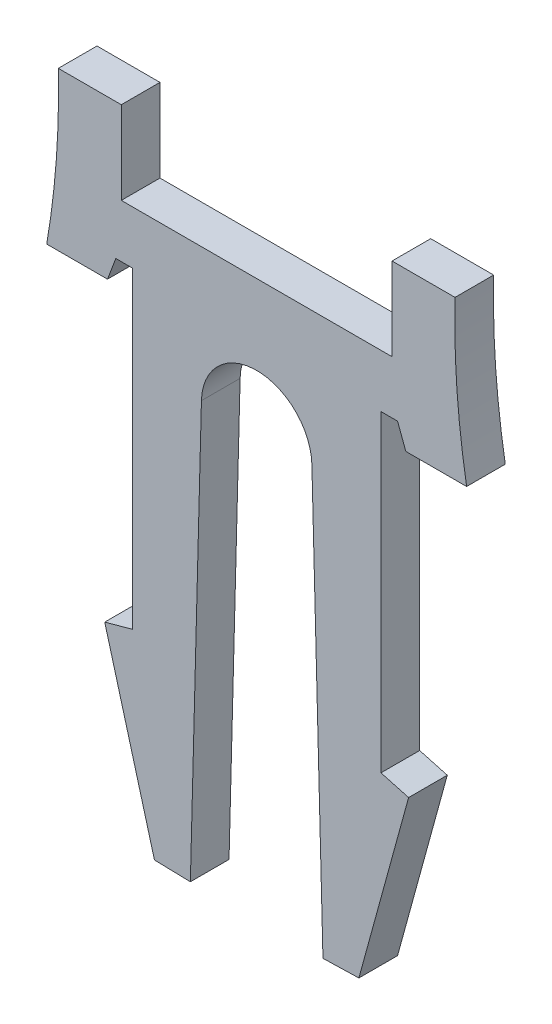
ISO-10303-21;
HEADER;
FILE_DESCRIPTION(('STEP AP214'),'2;1');
FILE_NAME('part.step','',(''),(''),'','','');
FILE_SCHEMA(('AUTOMOTIVE_DESIGN { 1 0 10303 214 1 1 1 1 }'));
ENDSEC;
DATA;
#1=APPLICATION_CONTEXT('core data for automotive mechanical design processes');
#2=APPLICATION_PROTOCOL_DEFINITION('international standard','automotive_design',2000,#1);
#3=PRODUCT_CONTEXT('',#1,'mechanical');
#4=PRODUCT('Part','Part','',(#3));
#5=PRODUCT_RELATED_PRODUCT_CATEGORY('part','',(#4));
#6=PRODUCT_DEFINITION_FORMATION('','',#4);
#7=PRODUCT_DEFINITION_CONTEXT('part definition',#1,'design');
#8=PRODUCT_DEFINITION('design','',#6,#7);
#9=PRODUCT_DEFINITION_SHAPE('','',#8);
#10=(LENGTH_UNIT() NAMED_UNIT(*) SI_UNIT(.MILLI.,.METRE.));
#11=(NAMED_UNIT(*) PLANE_ANGLE_UNIT() SI_UNIT($,.RADIAN.));
#12=(NAMED_UNIT(*) SI_UNIT($,.STERADIAN.) SOLID_ANGLE_UNIT());
#13=UNCERTAINTY_MEASURE_WITH_UNIT(LENGTH_MEASURE(1.E-05),#10,'distance_accuracy_value','');
#14=(GEOMETRIC_REPRESENTATION_CONTEXT(3) GLOBAL_UNCERTAINTY_ASSIGNED_CONTEXT((#13)) GLOBAL_UNIT_ASSIGNED_CONTEXT((#10,
#11,#12)) REPRESENTATION_CONTEXT('',''));
#15=CARTESIAN_POINT('',(0.,0.,0.));
#16=DIRECTION('',(0.,0.,1.));
#17=DIRECTION('',(1.,0.,0.));
#18=AXIS2_PLACEMENT_3D('',#15,#16,#17);
#19=CARTESIAN_POINT('',(-1.225,1.22,-0.35));
#20=DIRECTION('',(1.,0.,0.));
#21=DIRECTION('',(0.,0.,-1.));
#22=AXIS2_PLACEMENT_3D('',#19,#20,#21);
#23=PLANE('',#22);
#24=DIRECTION('',(0.,1.,0.));
#25=VECTOR('',#24,1.);
#26=CARTESIAN_POINT('',(-1.225,1.22,0.));
#27=LINE('',#26,#25);
#28=CARTESIAN_POINT('',(-1.225,1.22,0.));
#29=VERTEX_POINT('',#28);
#30=CARTESIAN_POINT('',(-1.225,1.97,0.));
#31=VERTEX_POINT('',#30);
#32=EDGE_CURVE('E229',#29,#31,#27,.T.);
#33=ORIENTED_EDGE('',*,*,#32,.F.);
#34=DIRECTION('',(0.,0.,1.));
#35=VECTOR('',#34,1.);
#36=CARTESIAN_POINT('',(-1.225,1.22,-0.35));
#37=LINE('',#36,#35);
#38=CARTESIAN_POINT('',(-1.225,1.22,-0.35));
#39=VERTEX_POINT('',#38);
#40=EDGE_CURVE('E11',#39,#29,#37,.T.);
#41=ORIENTED_EDGE('',*,*,#40,.F.);
#42=DIRECTION('',(0.,1.,0.));
#43=VECTOR('',#42,1.);
#44=CARTESIAN_POINT('',(-1.225,1.22,-0.35));
#45=LINE('',#44,#43);
#46=CARTESIAN_POINT('',(-1.225,1.97,-0.35));
#47=VERTEX_POINT('',#46);
#48=EDGE_CURVE('E297',#39,#47,#45,.T.);
#49=ORIENTED_EDGE('',*,*,#48,.T.);
#50=DIRECTION('',(0.,0.,1.));
#51=VECTOR('',#50,1.);
#52=CARTESIAN_POINT('',(-1.225,1.97,-0.35));
#53=LINE('',#52,#51);
#54=EDGE_CURVE('E39',#47,#31,#53,.T.);
#55=ORIENTED_EDGE('',*,*,#54,.T.);
#56=EDGE_LOOP('',(#33,#41,#49,#55));
#57=FACE_BOUND('',#56,.T.);
#58=ADVANCED_FACE('F36',(#57),#23,.T.);
#59=CARTESIAN_POINT('',(-1.225,1.22,-0.35));
#60=DIRECTION('',(0.,1.,0.));
#61=DIRECTION('',(0.,0.,1.));
#62=AXIS2_PLACEMENT_3D('',#59,#60,#61);
#63=PLANE('',#62);
#64=DIRECTION('',(-1.,0.,0.));
#65=VECTOR('',#64,1.);
#66=CARTESIAN_POINT('',(-1.225,1.22,0.));
#67=LINE('',#66,#65);
#68=CARTESIAN_POINT('',(1.225,1.22,0.));
#69=VERTEX_POINT('',#68);
#70=EDGE_CURVE('E295',#69,#29,#67,.T.);
#71=ORIENTED_EDGE('',*,*,#70,.F.);
#72=DIRECTION('',(0.,0.,1.));
#73=VECTOR('',#72,1.);
#74=CARTESIAN_POINT('',(1.225,1.22,-0.35));
#75=LINE('',#74,#73);
#76=CARTESIAN_POINT('',(1.225,1.22,-0.35));
#77=VERTEX_POINT('',#76);
#78=EDGE_CURVE('E45',#77,#69,#75,.T.);
#79=ORIENTED_EDGE('',*,*,#78,.F.);
#80=DIRECTION('',(-1.,0.,0.));
#81=VECTOR('',#80,1.);
#82=CARTESIAN_POINT('',(-1.225,1.22,-0.35));
#83=LINE('',#82,#81);
#84=EDGE_CURVE('E219',#77,#39,#83,.T.);
#85=ORIENTED_EDGE('',*,*,#84,.T.);
#86=ORIENTED_EDGE('',*,*,#40,.T.);
#87=EDGE_LOOP('',(#71,#79,#85,#86));
#88=FACE_BOUND('',#87,.T.);
#89=ADVANCED_FACE('F341',(#88),#63,.T.);
#90=CARTESIAN_POINT('',(1.225,1.22,-0.35));
#91=DIRECTION('',(-1.,0.,0.));
#92=DIRECTION('',(0.,0.,1.));
#93=AXIS2_PLACEMENT_3D('',#90,#91,#92);
#94=PLANE('',#93);
#95=DIRECTION('',(0.,-1.,0.));
#96=VECTOR('',#95,1.);
#97=CARTESIAN_POINT('',(1.225,1.22,0.));
#98=LINE('',#97,#96);
#99=CARTESIAN_POINT('',(1.225,1.97,0.));
#100=VERTEX_POINT('',#99);
#101=EDGE_CURVE('E206',#100,#69,#98,.T.);
#102=ORIENTED_EDGE('',*,*,#101,.F.);
#103=DIRECTION('',(0.,0.,1.));
#104=VECTOR('',#103,1.);
#105=CARTESIAN_POINT('',(1.225,1.97,-0.35));
#106=LINE('',#105,#104);
#107=CARTESIAN_POINT('',(1.225,1.97,-0.35));
#108=VERTEX_POINT('',#107);
#109=EDGE_CURVE('E201',#108,#100,#106,.T.);
#110=ORIENTED_EDGE('',*,*,#109,.F.);
#111=DIRECTION('',(0.,-1.,0.));
#112=VECTOR('',#111,1.);
#113=CARTESIAN_POINT('',(1.225,1.22,-0.35));
#114=LINE('',#113,#112);
#115=EDGE_CURVE('E204',#108,#77,#114,.T.);
#116=ORIENTED_EDGE('',*,*,#115,.T.);
#117=ORIENTED_EDGE('',*,*,#78,.T.);
#118=EDGE_LOOP('',(#102,#110,#116,#117));
#119=FACE_BOUND('',#118,.T.);
#120=ADVANCED_FACE('F203',(#119),#94,.T.);
#121=CARTESIAN_POINT('',(1.225,1.97,-0.35));
#122=DIRECTION('',(0.,1.,0.));
#123=DIRECTION('',(-1.,0.,0.));
#124=AXIS2_PLACEMENT_3D('',#121,#122,#123);
#125=PLANE('',#124);
#126=DIRECTION('',(-1.,0.,0.));
#127=VECTOR('',#126,1.);
#128=CARTESIAN_POINT('',(1.225,1.97,0.));
#129=LINE('',#128,#127);
#130=CARTESIAN_POINT('',(1.795,1.97,0.));
#131=VERTEX_POINT('',#130);
#132=EDGE_CURVE('E292',#131,#100,#129,.T.);
#133=ORIENTED_EDGE('',*,*,#132,.F.);
#134=DIRECTION('',(0.,0.,1.));
#135=VECTOR('',#134,1.);
#136=CARTESIAN_POINT('',(1.795,1.97,-0.35));
#137=LINE('',#136,#135);
#138=CARTESIAN_POINT('',(1.795,1.97,-0.35));
#139=VERTEX_POINT('',#138);
#140=EDGE_CURVE('E211',#139,#131,#137,.T.);
#141=ORIENTED_EDGE('',*,*,#140,.F.);
#142=DIRECTION('',(-1.,0.,0.));
#143=VECTOR('',#142,1.);
#144=CARTESIAN_POINT('',(1.225,1.97,-0.35));
#145=LINE('',#144,#143);
#146=EDGE_CURVE('E217',#139,#108,#145,.T.);
#147=ORIENTED_EDGE('',*,*,#146,.T.);
#148=ORIENTED_EDGE('',*,*,#109,.T.);
#149=EDGE_LOOP('',(#133,#141,#147,#148));
#150=FACE_BOUND('',#149,.T.);
#151=ADVANCED_FACE('F221',(#150),#125,.T.);
#152=CARTESIAN_POINT('',(9.14292372881354,1.79067796610169,-0.35));
#153=DIRECTION('',(0.,0.,1.));
#154=DIRECTION('',(1.,0.,0.));
#155=AXIS2_PLACEMENT_3D('',#152,#153,#154);
#156=CYLINDRICAL_SURFACE('',#155,7.35011153087506);
#157=CARTESIAN_POINT('',(9.14292372881354,1.79067796610169,0.));
#158=DIRECTION('',(0.,0.,-1.));
#159=DIRECTION('',(1.,0.,0.));
#160=AXIS2_PLACEMENT_3D('',#157,#158,#159);
#161=CIRCLE('',#160,7.35011153087506);
#162=CARTESIAN_POINT('',(1.9,0.540000000000002,0.));
#163=VERTEX_POINT('',#162);
#164=EDGE_CURVE('E289',#163,#131,#161,.T.);
#165=ORIENTED_EDGE('',*,*,#164,.F.);
#166=DIRECTION('',(0.,0.,1.));
#167=VECTOR('',#166,1.);
#168=CARTESIAN_POINT('',(1.9,0.540000000000002,-0.35));
#169=LINE('',#168,#167);
#170=CARTESIAN_POINT('',(1.9,0.540000000000002,-0.35));
#171=VERTEX_POINT('',#170);
#172=EDGE_CURVE('E301',#171,#163,#169,.T.);
#173=ORIENTED_EDGE('',*,*,#172,.F.);
#174=CARTESIAN_POINT('',(9.14292372881354,1.79067796610169,-0.35));
#175=DIRECTION('',(0.,0.,-1.));
#176=DIRECTION('',(1.,0.,0.));
#177=AXIS2_PLACEMENT_3D('',#174,#175,#176);
#178=CIRCLE('',#177,7.35011153087506);
#179=EDGE_CURVE('E222',#171,#139,#178,.T.);
#180=ORIENTED_EDGE('',*,*,#179,.T.);
#181=ORIENTED_EDGE('',*,*,#140,.T.);
#182=EDGE_LOOP('',(#165,#173,#180,#181));
#183=FACE_BOUND('',#182,.T.);
#184=ADVANCED_FACE('F354',(#183),#156,.F.);
#185=CARTESIAN_POINT('',(1.9,0.54,-0.35));
#186=DIRECTION('',(0.,-1.,0.));
#187=DIRECTION('',(0.,0.,-1.));
#188=AXIS2_PLACEMENT_3D('',#185,#186,#187);
#189=PLANE('',#188);
#190=DIRECTION('',(1.,0.,0.));
#191=VECTOR('',#190,1.);
#192=CARTESIAN_POINT('',(1.9,0.54,0.));
#193=LINE('',#192,#191);
#194=CARTESIAN_POINT('',(1.35,0.54,0.));
#195=VERTEX_POINT('',#194);
#196=EDGE_CURVE('E286',#195,#163,#193,.T.);
#197=ORIENTED_EDGE('',*,*,#196,.F.);
#198=DIRECTION('',(0.,0.,1.));
#199=VECTOR('',#198,1.);
#200=CARTESIAN_POINT('',(1.35,0.54,-0.35));
#201=LINE('',#200,#199);
#202=CARTESIAN_POINT('',(1.35,0.54,-0.35));
#203=VERTEX_POINT('',#202);
#204=EDGE_CURVE('E303',#203,#195,#201,.T.);
#205=ORIENTED_EDGE('',*,*,#204,.F.);
#206=DIRECTION('',(1.,0.,0.));
#207=VECTOR('',#206,1.);
#208=CARTESIAN_POINT('',(1.9,0.54,-0.35));
#209=LINE('',#208,#207);
#210=EDGE_CURVE('E224',#203,#171,#209,.T.);
#211=ORIENTED_EDGE('',*,*,#210,.T.);
#212=ORIENTED_EDGE('',*,*,#172,.T.);
#213=EDGE_LOOP('',(#197,#205,#211,#212));
#214=FACE_BOUND('',#213,.T.);
#215=ADVANCED_FACE('F357',(#214),#189,.T.);
#216=CARTESIAN_POINT('',(1.35,0.54,-0.35));
#217=DIRECTION('',(-0.936329177569044,-0.351123441588393,0.));
#218=DIRECTION('',(0.351123441588393,-0.936329177569044,0.));
#219=AXIS2_PLACEMENT_3D('',#216,#217,#218);
#220=PLANE('',#219);
#221=DIRECTION('',(0.351123441588393,-0.936329177569044,0.));
#222=VECTOR('',#221,1.);
#223=CARTESIAN_POINT('',(1.35,0.54,0.));
#224=LINE('',#223,#222);
#225=CARTESIAN_POINT('',(1.275,0.74,0.));
#226=VERTEX_POINT('',#225);
#227=EDGE_CURVE('E283',#226,#195,#224,.T.);
#228=ORIENTED_EDGE('',*,*,#227,.F.);
#229=DIRECTION('',(0.,0.,1.));
#230=VECTOR('',#229,1.);
#231=CARTESIAN_POINT('',(1.275,0.74,-0.35));
#232=LINE('',#231,#230);
#233=CARTESIAN_POINT('',(1.275,0.74,-0.35));
#234=VERTEX_POINT('',#233);
#235=EDGE_CURVE('E305',#234,#226,#232,.T.);
#236=ORIENTED_EDGE('',*,*,#235,.F.);
#237=DIRECTION('',(0.351123441588393,-0.936329177569044,0.));
#238=VECTOR('',#237,1.);
#239=CARTESIAN_POINT('',(1.35,0.54,-0.35));
#240=LINE('',#239,#238);
#241=EDGE_CURVE('E699',#234,#203,#240,.T.);
#242=ORIENTED_EDGE('',*,*,#241,.T.);
#243=ORIENTED_EDGE('',*,*,#204,.T.);
#244=EDGE_LOOP('',(#228,#236,#242,#243));
#245=FACE_BOUND('',#244,.T.);
#246=ADVANCED_FACE('F361',(#245),#220,.T.);
#247=CARTESIAN_POINT('',(1.275,0.74,-0.35));
#248=DIRECTION('',(0.,-1.,0.));
#249=DIRECTION('',(0.,0.,-1.));
#250=AXIS2_PLACEMENT_3D('',#247,#248,#249);
#251=PLANE('',#250);
#252=DIRECTION('',(1.,0.,0.));
#253=VECTOR('',#252,1.);
#254=CARTESIAN_POINT('',(1.275,0.74,0.));
#255=LINE('',#254,#253);
#256=CARTESIAN_POINT('',(1.125,0.74,0.));
#257=VERTEX_POINT('',#256);
#258=EDGE_CURVE('E280',#257,#226,#255,.T.);
#259=ORIENTED_EDGE('',*,*,#258,.F.);
#260=DIRECTION('',(0.,0.,1.));
#261=VECTOR('',#260,1.);
#262=CARTESIAN_POINT('',(1.125,0.74,-0.35));
#263=LINE('',#262,#261);
#264=CARTESIAN_POINT('',(1.125,0.74,-0.35));
#265=VERTEX_POINT('',#264);
#266=EDGE_CURVE('E307',#265,#257,#263,.T.);
#267=ORIENTED_EDGE('',*,*,#266,.F.);
#268=DIRECTION('',(1.,0.,0.));
#269=VECTOR('',#268,1.);
#270=CARTESIAN_POINT('',(1.275,0.74,-0.35));
#271=LINE('',#270,#269);
#272=EDGE_CURVE('E703',#265,#234,#271,.T.);
#273=ORIENTED_EDGE('',*,*,#272,.T.);
#274=ORIENTED_EDGE('',*,*,#235,.T.);
#275=EDGE_LOOP('',(#259,#267,#273,#274));
#276=FACE_BOUND('',#275,.T.);
#277=ADVANCED_FACE('F365',(#276),#251,.T.);
#278=CARTESIAN_POINT('',(1.125,0.74,-0.35));
#279=DIRECTION('',(1.,0.,0.));
#280=DIRECTION('',(0.,0.,-1.));
#281=AXIS2_PLACEMENT_3D('',#278,#279,#280);
#282=PLANE('',#281);
#283=DIRECTION('',(0.,1.,0.));
#284=VECTOR('',#283,1.);
#285=CARTESIAN_POINT('',(1.125,0.74,0.));
#286=LINE('',#285,#284);
#287=CARTESIAN_POINT('',(1.125,-2.09137564335033,0.));
#288=VERTEX_POINT('',#287);
#289=EDGE_CURVE('E277',#288,#257,#286,.T.);
#290=ORIENTED_EDGE('',*,*,#289,.F.);
#291=DIRECTION('',(0.,0.,1.));
#292=VECTOR('',#291,1.);
#293=CARTESIAN_POINT('',(1.125,-2.09137564335033,-0.35));
#294=LINE('',#293,#292);
#295=CARTESIAN_POINT('',(1.125,-2.09137564335033,-0.35));
#296=VERTEX_POINT('',#295);
#297=EDGE_CURVE('E309',#296,#288,#294,.T.);
#298=ORIENTED_EDGE('',*,*,#297,.F.);
#299=DIRECTION('',(0.,1.,0.));
#300=VECTOR('',#299,1.);
#301=CARTESIAN_POINT('',(1.125,0.74,-0.35));
#302=LINE('',#301,#300);
#303=EDGE_CURVE('E692',#296,#265,#302,.T.);
#304=ORIENTED_EDGE('',*,*,#303,.T.);
#305=ORIENTED_EDGE('',*,*,#266,.T.);
#306=EDGE_LOOP('',(#290,#298,#304,#305));
#307=FACE_BOUND('',#306,.T.);
#308=ADVANCED_FACE('F369',(#307),#282,.T.);
#309=CARTESIAN_POINT('',(1.375,-2.16,-0.35));
#310=DIRECTION('',(0.26470588235294,0.964329194750294,0.));
#311=DIRECTION('',(-0.964329194750294,0.26470588235294,0.));
#312=AXIS2_PLACEMENT_3D('',#309,#310,#311);
#313=PLANE('',#312);
#314=DIRECTION('',(-0.964329194750294,0.26470588235294,0.));
#315=VECTOR('',#314,1.);
#316=CARTESIAN_POINT('',(1.375,-2.16,0.));
#317=LINE('',#316,#315);
#318=CARTESIAN_POINT('',(1.375,-2.16,0.));
#319=VERTEX_POINT('',#318);
#320=EDGE_CURVE('E274',#319,#288,#317,.T.);
#321=ORIENTED_EDGE('',*,*,#320,.F.);
#322=DIRECTION('',(0.,0.,1.));
#323=VECTOR('',#322,1.);
#324=CARTESIAN_POINT('',(1.375,-2.16,-0.35));
#325=LINE('',#324,#323);
#326=CARTESIAN_POINT('',(1.375,-2.16,-0.35));
#327=VERTEX_POINT('',#326);
#328=EDGE_CURVE('E311',#327,#319,#325,.T.);
#329=ORIENTED_EDGE('',*,*,#328,.F.);
#330=DIRECTION('',(-0.964329194750294,0.26470588235294,0.));
#331=VECTOR('',#330,1.);
#332=CARTESIAN_POINT('',(1.375,-2.16,-0.35));
#333=LINE('',#332,#331);
#334=EDGE_CURVE('E688',#327,#296,#333,.T.);
#335=ORIENTED_EDGE('',*,*,#334,.T.);
#336=ORIENTED_EDGE('',*,*,#297,.T.);
#337=EDGE_LOOP('',(#321,#329,#335,#336));
#338=FACE_BOUND('',#337,.T.);
#339=ADVANCED_FACE('F373',(#338),#313,.T.);
#340=CARTESIAN_POINT('',(0.925,-3.7993596310755,-0.35));
#341=DIRECTION('',(0.964329194750294,-0.264705882352941,0.));
#342=DIRECTION('',(0.264705882352941,0.964329194750294,0.));
#343=AXIS2_PLACEMENT_3D('',#340,#341,#342);
#344=PLANE('',#343);
#345=DIRECTION('',(0.264705882352941,0.964329194750294,0.));
#346=VECTOR('',#345,1.);
#347=CARTESIAN_POINT('',(0.925,-3.7993596310755,0.));
#348=LINE('',#347,#346);
#349=CARTESIAN_POINT('',(0.925,-3.7993596310755,0.));
#350=VERTEX_POINT('',#349);
#351=EDGE_CURVE('E271',#350,#319,#348,.T.);
#352=ORIENTED_EDGE('',*,*,#351,.F.);
#353=DIRECTION('',(0.,0.,1.));
#354=VECTOR('',#353,1.);
#355=CARTESIAN_POINT('',(0.925,-3.7993596310755,-0.35));
#356=LINE('',#355,#354);
#357=CARTESIAN_POINT('',(0.925,-3.7993596310755,-0.35));
#358=VERTEX_POINT('',#357);
#359=EDGE_CURVE('E313',#358,#350,#356,.T.);
#360=ORIENTED_EDGE('',*,*,#359,.F.);
#361=DIRECTION('',(0.264705882352941,0.964329194750294,0.));
#362=VECTOR('',#361,1.);
#363=CARTESIAN_POINT('',(0.925,-3.7993596310755,-0.35));
#364=LINE('',#363,#362);
#365=EDGE_CURVE('E709',#358,#327,#364,.T.);
#366=ORIENTED_EDGE('',*,*,#365,.T.);
#367=ORIENTED_EDGE('',*,*,#328,.T.);
#368=EDGE_LOOP('',(#352,#360,#366,#367));
#369=FACE_BOUND('',#368,.T.);
#370=ADVANCED_FACE('F377',(#369),#344,.T.);
#371=CARTESIAN_POINT('',(0.6,-3.80787990170184,-0.35));
#372=DIRECTION('',(0.0262072128803839,-0.999656532011391,0.));
#373=DIRECTION('',(0.999656532011391,0.0262072128803839,0.));
#374=AXIS2_PLACEMENT_3D('',#371,#372,#373);
#375=PLANE('',#374);
#376=DIRECTION('',(0.999656532011392,0.0262072128803839,0.));
#377=VECTOR('',#376,1.);
#378=CARTESIAN_POINT('',(0.6,-3.80787990170184,0.));
#379=LINE('',#378,#377);
#380=CARTESIAN_POINT('',(0.6,-3.80787990170184,0.));
#381=VERTEX_POINT('',#380);
#382=EDGE_CURVE('E268',#381,#350,#379,.T.);
#383=ORIENTED_EDGE('',*,*,#382,.F.);
#384=DIRECTION('',(0.,0.,1.));
#385=VECTOR('',#384,1.);
#386=CARTESIAN_POINT('',(0.6,-3.80787990170184,-0.35));
#387=LINE('',#386,#385);
#388=CARTESIAN_POINT('',(0.6,-3.80787990170184,-0.35));
#389=VERTEX_POINT('',#388);
#390=EDGE_CURVE('E315',#389,#381,#387,.T.);
#391=ORIENTED_EDGE('',*,*,#390,.F.);
#392=DIRECTION('',(0.999656532011392,0.0262072128803839,0.));
#393=VECTOR('',#392,1.);
#394=CARTESIAN_POINT('',(0.6,-3.80787990170184,-0.35));
#395=LINE('',#394,#393);
#396=EDGE_CURVE('E681',#389,#358,#395,.T.);
#397=ORIENTED_EDGE('',*,*,#396,.T.);
#398=ORIENTED_EDGE('',*,*,#359,.T.);
#399=EDGE_LOOP('',(#383,#391,#397,#398));
#400=FACE_BOUND('',#399,.T.);
#401=ADVANCED_FACE('F381',(#400),#375,.T.);
#402=CARTESIAN_POINT('',(0.499828266005696,0.0131036064401919,-0.35));
#403=DIRECTION('',(-0.999656532011392,-0.0262072128803837,0.));
#404=DIRECTION('',(0.0262072128803837,-0.999656532011392,0.));
#405=AXIS2_PLACEMENT_3D('',#402,#403,#404);
#406=PLANE('',#405);
#407=DIRECTION('',(0.0262072128803837,-0.999656532011392,0.));
#408=VECTOR('',#407,1.);
#409=CARTESIAN_POINT('',(0.499828266005696,0.0131036064401919,0.));
#410=LINE('',#409,#408);
#411=CARTESIAN_POINT('',(0.499828266005696,0.0131036064401919,0.));
#412=VERTEX_POINT('',#411);
#413=EDGE_CURVE('E265',#412,#381,#410,.T.);
#414=ORIENTED_EDGE('',*,*,#413,.F.);
#415=DIRECTION('',(0.,0.,1.));
#416=VECTOR('',#415,1.);
#417=CARTESIAN_POINT('',(0.499828266005696,0.0131036064401919,-0.35));
#418=LINE('',#417,#416);
#419=CARTESIAN_POINT('',(0.499828266005696,0.0131036064401919,-0.35));
#420=VERTEX_POINT('',#419);
#421=EDGE_CURVE('E317',#420,#412,#418,.T.);
#422=ORIENTED_EDGE('',*,*,#421,.F.);
#423=DIRECTION('',(0.0262072128803837,-0.999656532011392,0.));
#424=VECTOR('',#423,1.);
#425=CARTESIAN_POINT('',(0.499828266005696,0.0131036064401919,-0.35));
#426=LINE('',#425,#424);
#427=EDGE_CURVE('E677',#420,#389,#426,.T.);
#428=ORIENTED_EDGE('',*,*,#427,.T.);
#429=ORIENTED_EDGE('',*,*,#390,.T.);
#430=EDGE_LOOP('',(#414,#422,#428,#429));
#431=FACE_BOUND('',#430,.T.);
#432=ADVANCED_FACE('F385',(#431),#406,.T.);
#433=CARTESIAN_POINT('',(0.,0.,-0.35));
#434=DIRECTION('',(0.,0.,1.));
#435=DIRECTION('',(1.,0.,0.));
#436=AXIS2_PLACEMENT_3D('',#433,#434,#435);
#437=CYLINDRICAL_SURFACE('',#436,0.5);
#438=CARTESIAN_POINT('',(0.,0.,0.));
#439=DIRECTION('',(0.,0.,-1.));
#440=DIRECTION('',(1.,0.,0.));
#441=AXIS2_PLACEMENT_3D('',#438,#439,#440);
#442=CIRCLE('',#441,0.5);
#443=CARTESIAN_POINT('',(-0.499828266005696,0.0131036064401919,0.));
#444=VERTEX_POINT('',#443);
#445=EDGE_CURVE('E262',#444,#412,#442,.T.);
#446=ORIENTED_EDGE('',*,*,#445,.F.);
#447=DIRECTION('',(0.,0.,1.));
#448=VECTOR('',#447,1.);
#449=CARTESIAN_POINT('',(-0.499828266005696,0.0131036064401919,-0.35));
#450=LINE('',#449,#448);
#451=CARTESIAN_POINT('',(-0.499828266005696,0.0131036064401919,-0.35));
#452=VERTEX_POINT('',#451);
#453=EDGE_CURVE('E319',#452,#444,#450,.T.);
#454=ORIENTED_EDGE('',*,*,#453,.F.);
#455=CARTESIAN_POINT('',(0.,0.,-0.35));
#456=DIRECTION('',(0.,0.,-1.));
#457=DIRECTION('',(1.,0.,0.));
#458=AXIS2_PLACEMENT_3D('',#455,#456,#457);
#459=CIRCLE('',#458,0.5);
#460=EDGE_CURVE('E713',#452,#420,#459,.T.);
#461=ORIENTED_EDGE('',*,*,#460,.T.);
#462=ORIENTED_EDGE('',*,*,#421,.T.);
#463=EDGE_LOOP('',(#446,#454,#461,#462));
#464=FACE_BOUND('',#463,.T.);
#465=ADVANCED_FACE('F389',(#464),#437,.F.);
#466=CARTESIAN_POINT('',(-0.499828266005696,0.0131036064401919,-0.35));
#467=DIRECTION('',(0.999656532011392,-0.0262072128803837,0.));
#468=DIRECTION('',(0.0262072128803837,0.999656532011392,0.));
#469=AXIS2_PLACEMENT_3D('',#466,#467,#468);
#470=PLANE('',#469);
#471=DIRECTION('',(0.0262072128803837,0.999656532011392,0.));
#472=VECTOR('',#471,1.);
#473=CARTESIAN_POINT('',(-0.499828266005696,0.0131036064401919,0.));
#474=LINE('',#473,#472);
#475=CARTESIAN_POINT('',(-0.6,-3.80787990170184,0.));
#476=VERTEX_POINT('',#475);
#477=EDGE_CURVE('E259',#476,#444,#474,.T.);
#478=ORIENTED_EDGE('',*,*,#477,.F.);
#479=DIRECTION('',(0.,0.,1.));
#480=VECTOR('',#479,1.);
#481=CARTESIAN_POINT('',(-0.6,-3.80787990170184,-0.35));
#482=LINE('',#481,#480);
#483=CARTESIAN_POINT('',(-0.6,-3.80787990170184,-0.35));
#484=VERTEX_POINT('',#483);
#485=EDGE_CURVE('E321',#484,#476,#482,.T.);
#486=ORIENTED_EDGE('',*,*,#485,.F.);
#487=DIRECTION('',(0.0262072128803837,0.999656532011392,0.));
#488=VECTOR('',#487,1.);
#489=CARTESIAN_POINT('',(-0.499828266005696,0.0131036064401919,-0.35));
#490=LINE('',#489,#488);
#491=EDGE_CURVE('E670',#484,#452,#490,.T.);
#492=ORIENTED_EDGE('',*,*,#491,.T.);
#493=ORIENTED_EDGE('',*,*,#453,.T.);
#494=EDGE_LOOP('',(#478,#486,#492,#493));
#495=FACE_BOUND('',#494,.T.);
#496=ADVANCED_FACE('F393',(#495),#470,.T.);
#497=CARTESIAN_POINT('',(-0.6,-3.80787990170184,-0.35));
#498=DIRECTION('',(-0.0262072128803839,-0.999656532011391,0.));
#499=DIRECTION('',(0.999656532011391,-0.0262072128803839,0.));
#500=AXIS2_PLACEMENT_3D('',#497,#498,#499);
#501=PLANE('',#500);
#502=DIRECTION('',(0.999656532011392,-0.0262072128803839,0.));
#503=VECTOR('',#502,1.);
#504=CARTESIAN_POINT('',(-0.6,-3.80787990170184,0.));
#505=LINE('',#504,#503);
#506=CARTESIAN_POINT('',(-0.925,-3.7993596310755,0.));
#507=VERTEX_POINT('',#506);
#508=EDGE_CURVE('E256',#507,#476,#505,.T.);
#509=ORIENTED_EDGE('',*,*,#508,.F.);
#510=DIRECTION('',(0.,0.,1.));
#511=VECTOR('',#510,1.);
#512=CARTESIAN_POINT('',(-0.925,-3.7993596310755,-0.35));
#513=LINE('',#512,#511);
#514=CARTESIAN_POINT('',(-0.925,-3.7993596310755,-0.35));
#515=VERTEX_POINT('',#514);
#516=EDGE_CURVE('E323',#515,#507,#513,.T.);
#517=ORIENTED_EDGE('',*,*,#516,.F.);
#518=DIRECTION('',(0.999656532011392,-0.0262072128803839,0.));
#519=VECTOR('',#518,1.);
#520=CARTESIAN_POINT('',(-0.6,-3.80787990170184,-0.35));
#521=LINE('',#520,#519);
#522=EDGE_CURVE('E666',#515,#484,#521,.T.);
#523=ORIENTED_EDGE('',*,*,#522,.T.);
#524=ORIENTED_EDGE('',*,*,#485,.T.);
#525=EDGE_LOOP('',(#509,#517,#523,#524));
#526=FACE_BOUND('',#525,.T.);
#527=ADVANCED_FACE('F397',(#526),#501,.T.);
#528=CARTESIAN_POINT('',(-0.925,-3.7993596310755,-0.35));
#529=DIRECTION('',(-0.964329194750294,-0.264705882352941,0.));
#530=DIRECTION('',(0.264705882352941,-0.964329194750294,0.));
#531=AXIS2_PLACEMENT_3D('',#528,#529,#530);
#532=PLANE('',#531);
#533=DIRECTION('',(0.264705882352941,-0.964329194750294,0.));
#534=VECTOR('',#533,1.);
#535=CARTESIAN_POINT('',(-0.925,-3.7993596310755,0.));
#536=LINE('',#535,#534);
#537=CARTESIAN_POINT('',(-1.375,-2.16,0.));
#538=VERTEX_POINT('',#537);
#539=EDGE_CURVE('E253',#538,#507,#536,.T.);
#540=ORIENTED_EDGE('',*,*,#539,.F.);
#541=DIRECTION('',(0.,0.,1.));
#542=VECTOR('',#541,1.);
#543=CARTESIAN_POINT('',(-1.375,-2.16,-0.35));
#544=LINE('',#543,#542);
#545=CARTESIAN_POINT('',(-1.375,-2.16,-0.35));
#546=VERTEX_POINT('',#545);
#547=EDGE_CURVE('E325',#546,#538,#544,.T.);
#548=ORIENTED_EDGE('',*,*,#547,.F.);
#549=DIRECTION('',(0.264705882352941,-0.964329194750294,0.));
#550=VECTOR('',#549,1.);
#551=CARTESIAN_POINT('',(-0.925,-3.7993596310755,-0.35));
#552=LINE('',#551,#550);
#553=EDGE_CURVE('E717',#546,#515,#552,.T.);
#554=ORIENTED_EDGE('',*,*,#553,.T.);
#555=ORIENTED_EDGE('',*,*,#516,.T.);
#556=EDGE_LOOP('',(#540,#548,#554,#555));
#557=FACE_BOUND('',#556,.T.);
#558=ADVANCED_FACE('F401',(#557),#532,.T.);
#559=CARTESIAN_POINT('',(-1.375,-2.16,-0.35));
#560=DIRECTION('',(-0.264705882352942,0.964329194750294,0.));
#561=DIRECTION('',(-0.964329194750294,-0.264705882352942,0.));
#562=AXIS2_PLACEMENT_3D('',#559,#560,#561);
#563=PLANE('',#562);
#564=DIRECTION('',(-0.964329194750294,-0.264705882352942,0.));
#565=VECTOR('',#564,1.);
#566=CARTESIAN_POINT('',(-1.375,-2.16,0.));
#567=LINE('',#566,#565);
#568=CARTESIAN_POINT('',(-1.125,-2.09137564335033,0.));
#569=VERTEX_POINT('',#568);
#570=EDGE_CURVE('E250',#569,#538,#567,.T.);
#571=ORIENTED_EDGE('',*,*,#570,.F.);
#572=DIRECTION('',(0.,0.,1.));
#573=VECTOR('',#572,1.);
#574=CARTESIAN_POINT('',(-1.125,-2.09137564335033,-0.35));
#575=LINE('',#574,#573);
#576=CARTESIAN_POINT('',(-1.125,-2.09137564335033,-0.35));
#577=VERTEX_POINT('',#576);
#578=EDGE_CURVE('E327',#577,#569,#575,.T.);
#579=ORIENTED_EDGE('',*,*,#578,.F.);
#580=DIRECTION('',(-0.964329194750294,-0.264705882352942,0.));
#581=VECTOR('',#580,1.);
#582=CARTESIAN_POINT('',(-1.375,-2.16,-0.35));
#583=LINE('',#582,#581);
#584=EDGE_CURVE('E659',#577,#546,#583,.T.);
#585=ORIENTED_EDGE('',*,*,#584,.T.);
#586=ORIENTED_EDGE('',*,*,#547,.T.);
#587=EDGE_LOOP('',(#571,#579,#585,#586));
#588=FACE_BOUND('',#587,.T.);
#589=ADVANCED_FACE('F405',(#588),#563,.T.);
#590=CARTESIAN_POINT('',(-1.125,-2.09137564335033,-0.35));
#591=DIRECTION('',(-1.,0.,0.));
#592=DIRECTION('',(0.,0.,1.));
#593=AXIS2_PLACEMENT_3D('',#590,#591,#592);
#594=PLANE('',#593);
#595=DIRECTION('',(0.,-1.,0.));
#596=VECTOR('',#595,1.);
#597=CARTESIAN_POINT('',(-1.125,-2.09137564335033,0.));
#598=LINE('',#597,#596);
#599=CARTESIAN_POINT('',(-1.125,0.74,0.));
#600=VERTEX_POINT('',#599);
#601=EDGE_CURVE('E247',#600,#569,#598,.T.);
#602=ORIENTED_EDGE('',*,*,#601,.F.);
#603=DIRECTION('',(0.,0.,1.));
#604=VECTOR('',#603,1.);
#605=CARTESIAN_POINT('',(-1.125,0.74,-0.35));
#606=LINE('',#605,#604);
#607=CARTESIAN_POINT('',(-1.125,0.74,-0.35));
#608=VERTEX_POINT('',#607);
#609=EDGE_CURVE('E329',#608,#600,#606,.T.);
#610=ORIENTED_EDGE('',*,*,#609,.F.);
#611=DIRECTION('',(0.,-1.,0.));
#612=VECTOR('',#611,1.);
#613=CARTESIAN_POINT('',(-1.125,-2.09137564335033,-0.35));
#614=LINE('',#613,#612);
#615=EDGE_CURVE('E655',#608,#577,#614,.T.);
#616=ORIENTED_EDGE('',*,*,#615,.T.);
#617=ORIENTED_EDGE('',*,*,#578,.T.);
#618=EDGE_LOOP('',(#602,#610,#616,#617));
#619=FACE_BOUND('',#618,.T.);
#620=ADVANCED_FACE('F409',(#619),#594,.T.);
#621=CARTESIAN_POINT('',(-1.275,0.74,-0.35));
#622=DIRECTION('',(0.,-1.,0.));
#623=DIRECTION('',(0.,0.,-1.));
#624=AXIS2_PLACEMENT_3D('',#621,#622,#623);
#625=PLANE('',#624);
#626=DIRECTION('',(1.,0.,0.));
#627=VECTOR('',#626,1.);
#628=CARTESIAN_POINT('',(-1.275,0.74,0.));
#629=LINE('',#628,#627);
#630=CARTESIAN_POINT('',(-1.275,0.74,0.));
#631=VERTEX_POINT('',#630);
#632=EDGE_CURVE('E244',#631,#600,#629,.T.);
#633=ORIENTED_EDGE('',*,*,#632,.F.);
#634=DIRECTION('',(0.,0.,1.));
#635=VECTOR('',#634,1.);
#636=CARTESIAN_POINT('',(-1.275,0.74,-0.35));
#637=LINE('',#636,#635);
#638=CARTESIAN_POINT('',(-1.275,0.74,-0.35));
#639=VERTEX_POINT('',#638);
#640=EDGE_CURVE('E331',#639,#631,#637,.T.);
#641=ORIENTED_EDGE('',*,*,#640,.F.);
#642=DIRECTION('',(1.,0.,0.));
#643=VECTOR('',#642,1.);
#644=CARTESIAN_POINT('',(-1.275,0.74,-0.35));
#645=LINE('',#644,#643);
#646=EDGE_CURVE('E721',#639,#608,#645,.T.);
#647=ORIENTED_EDGE('',*,*,#646,.T.);
#648=ORIENTED_EDGE('',*,*,#609,.T.);
#649=EDGE_LOOP('',(#633,#641,#647,#648));
#650=FACE_BOUND('',#649,.T.);
#651=ADVANCED_FACE('F413',(#650),#625,.T.);
#652=CARTESIAN_POINT('',(-1.35,0.54,-0.35));
#653=DIRECTION('',(0.936329177569044,-0.351123441588393,0.));
#654=DIRECTION('',(0.351123441588393,0.936329177569044,0.));
#655=AXIS2_PLACEMENT_3D('',#652,#653,#654);
#656=PLANE('',#655);
#657=DIRECTION('',(0.351123441588393,0.936329177569044,0.));
#658=VECTOR('',#657,1.);
#659=CARTESIAN_POINT('',(-1.35,0.54,0.));
#660=LINE('',#659,#658);
#661=CARTESIAN_POINT('',(-1.35,0.54,0.));
#662=VERTEX_POINT('',#661);
#663=EDGE_CURVE('E241',#662,#631,#660,.T.);
#664=ORIENTED_EDGE('',*,*,#663,.F.);
#665=DIRECTION('',(0.,0.,1.));
#666=VECTOR('',#665,1.);
#667=CARTESIAN_POINT('',(-1.35,0.54,-0.35));
#668=LINE('',#667,#666);
#669=CARTESIAN_POINT('',(-1.35,0.54,-0.35));
#670=VERTEX_POINT('',#669);
#671=EDGE_CURVE('E333',#670,#662,#668,.T.);
#672=ORIENTED_EDGE('',*,*,#671,.F.);
#673=DIRECTION('',(0.351123441588393,0.936329177569044,0.));
#674=VECTOR('',#673,1.);
#675=CARTESIAN_POINT('',(-1.35,0.54,-0.35));
#676=LINE('',#675,#674);
#677=EDGE_CURVE('E648',#670,#639,#676,.T.);
#678=ORIENTED_EDGE('',*,*,#677,.T.);
#679=ORIENTED_EDGE('',*,*,#640,.T.);
#680=EDGE_LOOP('',(#664,#672,#678,#679));
#681=FACE_BOUND('',#680,.T.);
#682=ADVANCED_FACE('F417',(#681),#656,.T.);
#683=CARTESIAN_POINT('',(-1.9,0.54,-0.35));
#684=DIRECTION('',(0.,-1.,0.));
#685=DIRECTION('',(0.,0.,-1.));
#686=AXIS2_PLACEMENT_3D('',#683,#684,#685);
#687=PLANE('',#686);
#688=DIRECTION('',(1.,0.,0.));
#689=VECTOR('',#688,1.);
#690=CARTESIAN_POINT('',(-1.9,0.54,0.));
#691=LINE('',#690,#689);
#692=CARTESIAN_POINT('',(-1.9,0.54,0.));
#693=VERTEX_POINT('',#692);
#694=EDGE_CURVE('E238',#693,#662,#691,.T.);
#695=ORIENTED_EDGE('',*,*,#694,.F.);
#696=DIRECTION('',(0.,0.,1.));
#697=VECTOR('',#696,1.);
#698=CARTESIAN_POINT('',(-1.9,0.54,-0.35));
#699=LINE('',#698,#697);
#700=CARTESIAN_POINT('',(-1.9,0.54,-0.35));
#701=VERTEX_POINT('',#700);
#702=EDGE_CURVE('E335',#701,#693,#699,.T.);
#703=ORIENTED_EDGE('',*,*,#702,.F.);
#704=DIRECTION('',(1.,0.,0.));
#705=VECTOR('',#704,1.);
#706=CARTESIAN_POINT('',(-1.9,0.54,-0.35));
#707=LINE('',#706,#705);
#708=EDGE_CURVE('E644',#701,#670,#707,.T.);
#709=ORIENTED_EDGE('',*,*,#708,.T.);
#710=ORIENTED_EDGE('',*,*,#671,.T.);
#711=EDGE_LOOP('',(#695,#703,#709,#710));
#712=FACE_BOUND('',#711,.T.);
#713=ADVANCED_FACE('F421',(#712),#687,.T.);
#714=CARTESIAN_POINT('',(-9.14292372881354,1.79067796610169,-0.35));
#715=DIRECTION('',(0.,0.,1.));
#716=DIRECTION('',(1.,0.,0.));
#717=AXIS2_PLACEMENT_3D('',#714,#715,#716);
#718=CYLINDRICAL_SURFACE('',#717,7.35011153087506);
#719=CARTESIAN_POINT('',(-9.14292372881354,1.79067796610169,0.));
#720=DIRECTION('',(0.,0.,-1.));
#721=DIRECTION('',(-1.,0.,0.));
#722=AXIS2_PLACEMENT_3D('',#719,#720,#721);
#723=CIRCLE('',#722,7.35011153087506);
#724=CARTESIAN_POINT('',(-1.795,1.97,0.));
#725=VERTEX_POINT('',#724);
#726=EDGE_CURVE('E235',#725,#693,#723,.T.);
#727=ORIENTED_EDGE('',*,*,#726,.F.);
#728=DIRECTION('',(0.,0.,1.));
#729=VECTOR('',#728,1.);
#730=CARTESIAN_POINT('',(-1.795,1.97,-0.35));
#731=LINE('',#730,#729);
#732=CARTESIAN_POINT('',(-1.795,1.97,-0.35));
#733=VERTEX_POINT('',#732);
#734=EDGE_CURVE('E336',#733,#725,#731,.T.);
#735=ORIENTED_EDGE('',*,*,#734,.F.);
#736=CARTESIAN_POINT('',(-9.14292372881354,1.79067796610169,-0.35));
#737=DIRECTION('',(0.,0.,-1.));
#738=DIRECTION('',(-1.,0.,0.));
#739=AXIS2_PLACEMENT_3D('',#736,#737,#738);
#740=CIRCLE('',#739,7.35011153087506);
#741=EDGE_CURVE('E725',#733,#701,#740,.T.);
#742=ORIENTED_EDGE('',*,*,#741,.T.);
#743=ORIENTED_EDGE('',*,*,#702,.T.);
#744=EDGE_LOOP('',(#727,#735,#742,#743));
#745=FACE_BOUND('',#744,.T.);
#746=ADVANCED_FACE('F425',(#745),#718,.F.);
#747=CARTESIAN_POINT('',(-1.225,1.97,-0.35));
#748=DIRECTION('',(0.,1.,0.));
#749=DIRECTION('',(0.,0.,1.));
#750=AXIS2_PLACEMENT_3D('',#747,#748,#749);
#751=PLANE('',#750);
#752=DIRECTION('',(-1.,0.,0.));
#753=VECTOR('',#752,1.);
#754=CARTESIAN_POINT('',(-1.225,1.97,0.));
#755=LINE('',#754,#753);
#756=EDGE_CURVE('E232',#31,#725,#755,.T.);
#757=ORIENTED_EDGE('',*,*,#756,.F.);
#758=ORIENTED_EDGE('',*,*,#54,.F.);
#759=DIRECTION('',(-1.,0.,0.));
#760=VECTOR('',#759,1.);
#761=CARTESIAN_POINT('',(-1.225,1.97,-0.35));
#762=LINE('',#761,#760);
#763=EDGE_CURVE('E727',#47,#733,#762,.T.);
#764=ORIENTED_EDGE('',*,*,#763,.T.);
#765=ORIENTED_EDGE('',*,*,#734,.T.);
#766=EDGE_LOOP('',(#757,#758,#764,#765));
#767=FACE_BOUND('',#766,.T.);
#768=ADVANCED_FACE('F338',(#767),#751,.T.);
#769=CARTESIAN_POINT('',(-9.14292372881354,1.79067796610169,-0.35));
#770=DIRECTION('',(0.,0.,-1.));
#771=DIRECTION('',(-1.,0.,0.));
#772=AXIS2_PLACEMENT_3D('',#769,#770,#771);
#773=PLANE('',#772);
#774=ORIENTED_EDGE('',*,*,#48,.F.);
#775=ORIENTED_EDGE('',*,*,#84,.F.);
#776=ORIENTED_EDGE('',*,*,#115,.F.);
#777=ORIENTED_EDGE('',*,*,#146,.F.);
#778=ORIENTED_EDGE('',*,*,#179,.F.);
#779=ORIENTED_EDGE('',*,*,#210,.F.);
#780=ORIENTED_EDGE('',*,*,#241,.F.);
#781=ORIENTED_EDGE('',*,*,#272,.F.);
#782=ORIENTED_EDGE('',*,*,#303,.F.);
#783=ORIENTED_EDGE('',*,*,#334,.F.);
#784=ORIENTED_EDGE('',*,*,#365,.F.);
#785=ORIENTED_EDGE('',*,*,#396,.F.);
#786=ORIENTED_EDGE('',*,*,#427,.F.);
#787=ORIENTED_EDGE('',*,*,#460,.F.);
#788=ORIENTED_EDGE('',*,*,#491,.F.);
#789=ORIENTED_EDGE('',*,*,#522,.F.);
#790=ORIENTED_EDGE('',*,*,#553,.F.);
#791=ORIENTED_EDGE('',*,*,#584,.F.);
#792=ORIENTED_EDGE('',*,*,#615,.F.);
#793=ORIENTED_EDGE('',*,*,#646,.F.);
#794=ORIENTED_EDGE('',*,*,#677,.F.);
#795=ORIENTED_EDGE('',*,*,#708,.F.);
#796=ORIENTED_EDGE('',*,*,#741,.F.);
#797=ORIENTED_EDGE('',*,*,#763,.F.);
#798=EDGE_LOOP('',(#774,#775,#776,#777,#778,#779,#780,#781,#782,#783,#784,#785,#786,#787,#788,
#789,#790,#791,#792,#793,#794,#795,#796,#797));
#799=FACE_BOUND('',#798,.T.);
#800=ADVANCED_FACE('F215',(#799),#773,.T.);
#801=CARTESIAN_POINT('',(-9.14292372881354,1.79067796610169,0.));
#802=DIRECTION('',(0.,0.,-1.));
#803=DIRECTION('',(-1.,0.,0.));
#804=AXIS2_PLACEMENT_3D('',#801,#802,#803);
#805=PLANE('',#804);
#806=ORIENTED_EDGE('',*,*,#32,.T.);
#807=ORIENTED_EDGE('',*,*,#756,.T.);
#808=ORIENTED_EDGE('',*,*,#726,.T.);
#809=ORIENTED_EDGE('',*,*,#694,.T.);
#810=ORIENTED_EDGE('',*,*,#663,.T.);
#811=ORIENTED_EDGE('',*,*,#632,.T.);
#812=ORIENTED_EDGE('',*,*,#601,.T.);
#813=ORIENTED_EDGE('',*,*,#570,.T.);
#814=ORIENTED_EDGE('',*,*,#539,.T.);
#815=ORIENTED_EDGE('',*,*,#508,.T.);
#816=ORIENTED_EDGE('',*,*,#477,.T.);
#817=ORIENTED_EDGE('',*,*,#445,.T.);
#818=ORIENTED_EDGE('',*,*,#413,.T.);
#819=ORIENTED_EDGE('',*,*,#382,.T.);
#820=ORIENTED_EDGE('',*,*,#351,.T.);
#821=ORIENTED_EDGE('',*,*,#320,.T.);
#822=ORIENTED_EDGE('',*,*,#289,.T.);
#823=ORIENTED_EDGE('',*,*,#258,.T.);
#824=ORIENTED_EDGE('',*,*,#227,.T.);
#825=ORIENTED_EDGE('',*,*,#196,.T.);
#826=ORIENTED_EDGE('',*,*,#164,.T.);
#827=ORIENTED_EDGE('',*,*,#132,.T.);
#828=ORIENTED_EDGE('',*,*,#101,.T.);
#829=ORIENTED_EDGE('',*,*,#70,.T.);
#830=EDGE_LOOP('',(#806,#807,#808,#809,#810,#811,#812,#813,#814,#815,#816,#817,#818,#819,#820,
#821,#822,#823,#824,#825,#826,#827,#828,#829));
#831=FACE_BOUND('',#830,.T.);
#832=ADVANCED_FACE('F340',(#831),#805,.F.);
#833=CLOSED_SHELL('',(#58,#89,#120,#151,#184,#215,#246,#277,#308,#339,#370,#401,#432,#465,#496,
#527,#558,#589,#620,#651,#682,#713,#746,#768,#800,#832));
#834=MANIFOLD_SOLID_BREP('B2',#833);
#835=ADVANCED_BREP_SHAPE_REPRESENTATION('',(#18,#834),#14);
#836=SHAPE_DEFINITION_REPRESENTATION(#9,#835);
ENDSEC;
END-ISO-10303-21;
